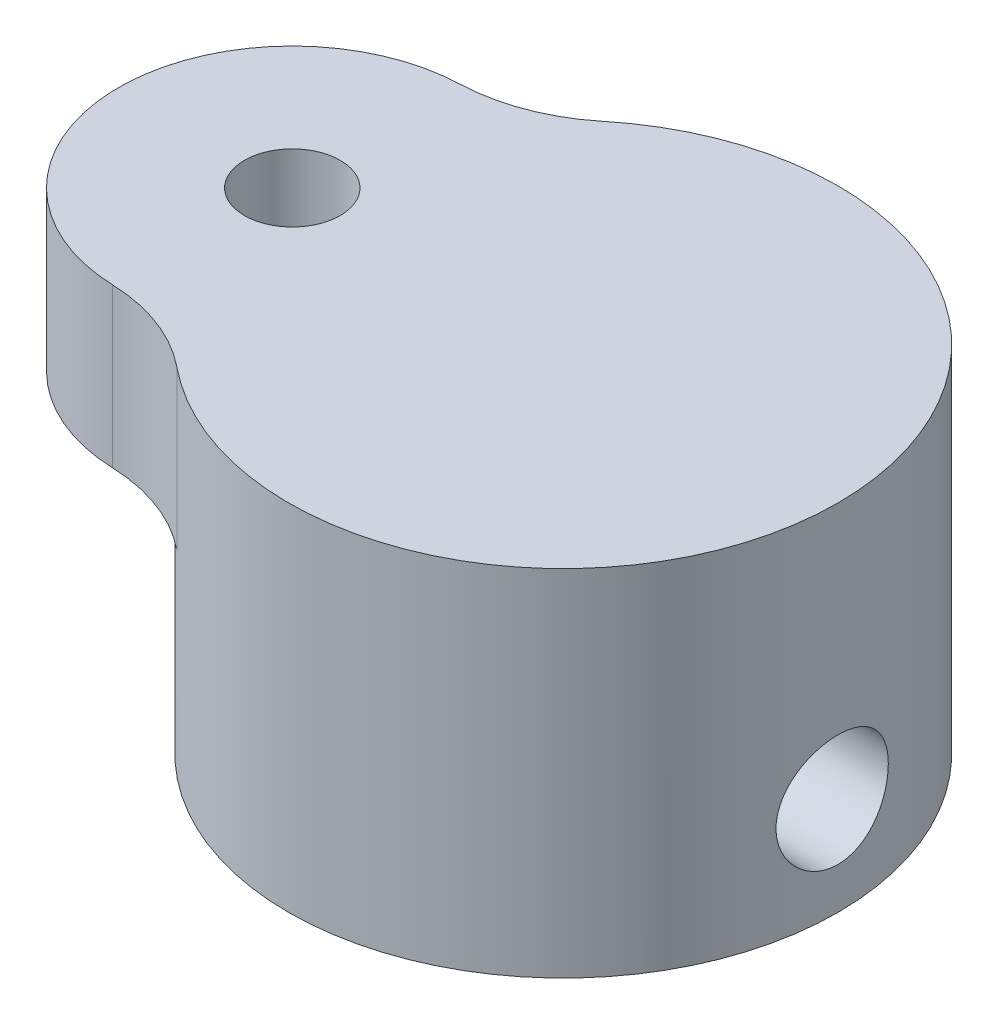
ISO-10303-21;
HEADER;
FILE_DESCRIPTION(('STEP AP214'),'2;1');
FILE_NAME('part.step','',(''),(''),'','','');
FILE_SCHEMA(('AUTOMOTIVE_DESIGN { 1 0 10303 214 1 1 1 1 }'));
ENDSEC;
DATA;
#1=APPLICATION_CONTEXT('core data for automotive mechanical design processes');
#2=APPLICATION_PROTOCOL_DEFINITION('international standard','automotive_design',2000,#1);
#3=PRODUCT_CONTEXT('',#1,'mechanical');
#4=PRODUCT('Part','Part','',(#3));
#5=PRODUCT_RELATED_PRODUCT_CATEGORY('part','',(#4));
#6=PRODUCT_DEFINITION_FORMATION('','',#4);
#7=PRODUCT_DEFINITION_CONTEXT('part definition',#1,'design');
#8=PRODUCT_DEFINITION('design','',#6,#7);
#9=PRODUCT_DEFINITION_SHAPE('','',#8);
#10=(LENGTH_UNIT() NAMED_UNIT(*) SI_UNIT(.MILLI.,.METRE.));
#11=(NAMED_UNIT(*) PLANE_ANGLE_UNIT() SI_UNIT($,.RADIAN.));
#12=(NAMED_UNIT(*) SI_UNIT($,.STERADIAN.) SOLID_ANGLE_UNIT());
#13=UNCERTAINTY_MEASURE_WITH_UNIT(LENGTH_MEASURE(1.E-05),#10,'distance_accuracy_value','');
#14=(GEOMETRIC_REPRESENTATION_CONTEXT(3) GLOBAL_UNCERTAINTY_ASSIGNED_CONTEXT((#13)) GLOBAL_UNIT_ASSIGNED_CONTEXT((#10,
#11,#12)) REPRESENTATION_CONTEXT('',''));
#15=CARTESIAN_POINT('',(0.,0.,0.));
#16=DIRECTION('',(0.,0.,1.));
#17=DIRECTION('',(1.,0.,0.));
#18=AXIS2_PLACEMENT_3D('',#15,#16,#17);
#19=CARTESIAN_POINT('',(0.,7.1628,0.));
#20=DIRECTION('',(0.,1.,0.));
#21=DIRECTION('',(0.,0.,1.));
#22=AXIS2_PLACEMENT_3D('',#19,#20,#21);
#23=PLANE('',#22);
#24=CARTESIAN_POINT('',(0.,7.1628,0.));
#25=DIRECTION('',(0.,1.,0.));
#26=DIRECTION('',(0.,0.,1.));
#27=AXIS2_PLACEMENT_3D('',#24,#25,#26);
#28=CIRCLE('',#27,10.033);
#29=CARTESIAN_POINT('',(-9.87921961814325,7.1628,-1.74988820685597));
#30=VERTEX_POINT('',#29);
#31=CARTESIAN_POINT('',(-9.87921961814325,7.1628,1.74988820685597));
#32=VERTEX_POINT('',#31);
#33=EDGE_CURVE('E61',#30,#32,#28,.T.);
#34=ORIENTED_EDGE('',*,*,#33,.T.);
#35=CARTESIAN_POINT('',(-9.899,7.1628,0.));
#36=DIRECTION('',(0.,1.,0.));
#37=DIRECTION('',(0.,0.,1.));
#38=AXIS2_PLACEMENT_3D('',#35,#36,#37);
#39=CIRCLE('',#38,1.75);
#40=EDGE_CURVE('E201',#32,#30,#39,.T.);
#41=ORIENTED_EDGE('',*,*,#40,.T.);
#42=EDGE_LOOP('',(#34,#41));
#43=FACE_BOUND('',#42,.T.);
#44=ADVANCED_FACE('F45',(#43),#23,.T.);
#45=CARTESIAN_POINT('',(0.,0.,0.));
#46=DIRECTION('',(0.,1.,0.));
#47=DIRECTION('',(0.,0.,1.));
#48=AXIS2_PLACEMENT_3D('',#45,#46,#47);
#49=PLANE('',#48);
#50=CARTESIAN_POINT('',(0.,0.,0.));
#51=DIRECTION('',(0.,1.,0.));
#52=DIRECTION('',(0.,0.,1.));
#53=AXIS2_PLACEMENT_3D('',#50,#51,#52);
#54=CIRCLE('',#53,10.033);
#55=CARTESIAN_POINT('',(0.,0.,10.033));
#56=VERTEX_POINT('',#55);
#57=EDGE_CURVE('E168',#56,#56,#54,.T.);
#58=ORIENTED_EDGE('',*,*,#57,.F.);
#59=EDGE_LOOP('',(#58));
#60=FACE_BOUND('',#59,.T.);
#61=CARTESIAN_POINT('',(0.,0.,0.));
#62=DIRECTION('',(0.,1.,0.));
#63=DIRECTION('',(0.,0.,1.));
#64=AXIS2_PLACEMENT_3D('',#61,#62,#63);
#65=CIRCLE('',#64,6.35);
#66=CARTESIAN_POINT('',(0.,0.,6.35));
#67=VERTEX_POINT('',#66);
#68=EDGE_CURVE('E171',#67,#67,#65,.T.);
#69=ORIENTED_EDGE('',*,*,#68,.T.);
#70=EDGE_LOOP('',(#69));
#71=FACE_BOUND('',#70,.T.);
#72=ADVANCED_FACE('F184',(#60,#71),#49,.F.);
#73=CARTESIAN_POINT('',(0.,7.1628,0.));
#74=DIRECTION('',(0.,-1.,0.));
#75=DIRECTION('',(0.,0.,-1.));
#76=AXIS2_PLACEMENT_3D('',#73,#74,#75);
#77=CYLINDRICAL_SURFACE('',#76,10.033);
#78=CARTESIAN_POINT('',(-10.033,1.51765,0.));
#79=CARTESIAN_POINT('',(-10.0329978938133,1.51765412690976,-0.113937335128595));
#80=CARTESIAN_POINT('',(-10.031039272284,1.5271760274107,-0.227926299373717));
#81=CARTESIAN_POINT('',(-10.0234149215753,1.56497967802849,-0.452678602559216));
#82=CARTESIAN_POINT('',(-10.0177463151306,1.59327598880525,-0.563439368184559));
#83=CARTESIAN_POINT('',(-10.003334558995,1.66771487473051,-0.778453560947287));
#84=CARTESIAN_POINT('',(-9.99459441647798,1.71383999905322,-0.882713235818526));
#85=CARTESIAN_POINT('',(-9.97498815621709,1.82257450550809,-1.0820075767369));
#86=CARTESIAN_POINT('',(-9.96412214851708,1.88518303444674,-1.1770427199044));
#87=CARTESIAN_POINT('',(-9.941287269236,2.02604385413697,-1.3565384414925));
#88=CARTESIAN_POINT('',(-9.92930618535681,2.10448401759188,-1.44085004585589));
#89=CARTESIAN_POINT('',(-9.90567969507248,2.27437773217348,-1.59521502792215));
#90=CARTESIAN_POINT('',(-9.89403431576375,2.36583233024397,-1.6652672574293));
#91=CARTESIAN_POINT('',(-9.87227826574829,2.56023730111255,-1.7897643723742));
#92=CARTESIAN_POINT('',(-9.86218329403356,2.66328900911285,-1.84405400740161));
#93=CARTESIAN_POINT('',(-9.84484492924291,2.877292345516,-1.93448997468271));
#94=CARTESIAN_POINT('',(-9.83760124107974,2.98824315501475,-1.97063818454932));
#95=CARTESIAN_POINT('',(-9.82690935694433,3.21328929618327,-2.02327955090995));
#96=CARTESIAN_POINT('',(-9.82341062960049,3.32732090792587,-2.0400346401901));
#97=CARTESIAN_POINT('',(-9.82045278872623,3.55662621379309,-2.05422793676965));
#98=CARTESIAN_POINT('',(-9.82099324320108,3.67189977377328,-2.05166820980854));
#99=CARTESIAN_POINT('',(-9.82600682712071,3.89849341853524,-2.02751608390376));
#100=CARTESIAN_POINT('',(-9.83041772181077,4.00984718845702,-2.00622486390185));
#101=CARTESIAN_POINT('',(-9.84257710508939,4.22736818084868,-1.94568993321072));
#102=CARTESIAN_POINT('',(-9.85032575949578,4.3335351453495,-1.90644533060257));
#103=CARTESIAN_POINT('',(-9.86835068432885,4.53853191496921,-1.81083260460387));
#104=CARTESIAN_POINT('',(-9.8786443579928,4.63730483076817,-1.75434592559944));
#105=CARTESIAN_POINT('',(-9.9005884273782,4.82408268751031,-1.62593607826633));
#106=CARTESIAN_POINT('',(-9.91223898563038,4.91208633589167,-1.55401105982649));
#107=CARTESIAN_POINT('',(-9.93585312560842,5.07656455703742,-1.39515784516706));
#108=CARTESIAN_POINT('',(-9.94781847235497,5.15279103656705,-1.30797280933532));
#109=CARTESIAN_POINT('',(-9.97051350902517,5.28957754530853,-1.12192576525978));
#110=CARTESIAN_POINT('',(-9.98124318170946,5.3501373559633,-1.0230635941427));
#111=CARTESIAN_POINT('',(-10.0002861376381,5.45392084940978,-0.816186808881739));
#112=CARTESIAN_POINT('',(-10.0085953293113,5.49711522404187,-0.708157091355755));
#113=CARTESIAN_POINT('',(-10.021830214061,5.56467209804774,-0.486166381256757));
#114=CARTESIAN_POINT('',(-10.0267563357125,5.58903698283302,-0.372206141944129));
#115=CARTESIAN_POINT('',(-10.0326100524303,5.61788981042246,-0.143720361692018));
#116=CARTESIAN_POINT('',(-10.0336059098286,5.62271712732434,-0.0292393722701828));
#117=CARTESIAN_POINT('',(-10.0316768825688,5.61327311187552,0.198893317994673));
#118=CARTESIAN_POINT('',(-10.0287522286538,5.59900290351559,0.312545067247062));
#119=CARTESIAN_POINT('',(-10.0193535952825,5.55205075939492,0.534691494930921));
#120=CARTESIAN_POINT('',(-10.0129133709725,5.51954384441336,0.64322471890889));
#121=CARTESIAN_POINT('',(-9.99720334369773,5.43723298189374,0.85329961069118));
#122=CARTESIAN_POINT('',(-9.98793332177014,5.38742769580876,0.954840736718576));
#123=CARTESIAN_POINT('',(-9.9674222882272,5.27120592029177,1.14947394805684));
#124=CARTESIAN_POINT('',(-9.95615771065381,5.20458624036418,1.24244216515935));
#125=CARTESIAN_POINT('',(-9.9329607368187,5.05689778883718,1.416001625691));
#126=CARTESIAN_POINT('',(-9.92102826561899,4.97582739362231,1.49659147644804));
#127=CARTESIAN_POINT('',(-9.89760895471395,4.79999089784795,1.6444237357585));
#128=CARTESIAN_POINT('',(-9.88613226216581,4.7050269257672,1.71143267937341));
#129=CARTESIAN_POINT('',(-9.86514317664098,4.5049921563381,1.82854960174829));
#130=CARTESIAN_POINT('',(-9.85563070332024,4.39992177263831,1.87865827184698));
#131=CARTESIAN_POINT('',(-9.83972993039722,4.18319583046762,1.9602381099439));
#132=CARTESIAN_POINT('',(-9.83332510073798,4.07157873463212,1.99180808137788));
#133=CARTESIAN_POINT('',(-9.82433088275876,3.84447853012828,2.03571190927881));
#134=CARTESIAN_POINT('',(-9.82174097160052,3.72899595344692,2.04804840172613));
#135=CARTESIAN_POINT('',(-9.82069976705395,3.49978911420012,2.05303412857708));
#136=CARTESIAN_POINT('',(-9.82217086359981,3.38607307518363,2.0460525454146));
#137=CARTESIAN_POINT('',(-9.82891202993507,3.16147332829043,2.01341751170842));
#138=CARTESIAN_POINT('',(-9.83418206612248,3.05058959537066,1.98776422631774));
#139=CARTESIAN_POINT('',(-9.84789188170742,2.83505032094469,1.91868187978882));
#140=CARTESIAN_POINT('',(-9.85632323691163,2.73037907570157,1.87530003383152));
#141=CARTESIAN_POINT('',(-9.87541013015298,2.52974362280196,1.77203520491748));
#142=CARTESIAN_POINT('',(-9.88606586525967,2.43378018769786,1.7121507597577));
#143=CARTESIAN_POINT('',(-9.90863706766511,2.25145024268038,1.57632803683832));
#144=CARTESIAN_POINT('',(-9.9205715213222,2.16528406690173,1.5001239341877));
#145=CARTESIAN_POINT('',(-9.94422122609122,2.0068403447861,1.33437162866727));
#146=CARTESIAN_POINT('',(-9.95593642615861,1.93456599718246,1.24482036088589));
#147=CARTESIAN_POINT('',(-9.9779801403421,1.80520264797843,1.05372857754947));
#148=CARTESIAN_POINT('',(-9.98829194532228,1.74828981853062,0.952066784219952));
#149=CARTESIAN_POINT('',(-10.0062019110632,1.65244683893929,0.740437723513406));
#150=CARTESIAN_POINT('',(-10.013802477838,1.61350073566951,0.630477925507787));
#151=CARTESIAN_POINT('',(-10.0239843601777,1.56210286826681,0.433584301903527));
#152=CARTESIAN_POINT('',(-10.0273451786663,1.54546323143088,0.347759291653972));
#153=CARTESIAN_POINT('',(-10.0318537675998,1.52323540625218,0.174632931031843));
#154=CARTESIAN_POINT('',(-10.0330016143674,1.51764683677205,0.0873316316793533));
#155=CARTESIAN_POINT('',(-10.033,1.51765,0.));
#156=B_SPLINE_CURVE_WITH_KNOTS('',3,(#78,#79,#80,#81,#82,#83,#84,#85,#86,#87,#88,#89,#90,#91,
#92,#93,#94,#95,#96,#97,#98,#99,#100,#101,#102,#103,#104,#105,#106,#107,#108,#109,#110,#111,
#112,#113,#114,#115,#116,#117,#118,#119,#120,#121,#122,#123,#124,#125,#126,#127,#128,#129,#130,
#131,#132,#133,#134,#135,#136,#137,#138,#139,#140,#141,#142,#143,#144,#145,#146,#147,#148,#149,
#150,#151,#152,#153,#154,#155),.UNSPECIFIED.,.T.,.F.,(4,2,2,2,2,2,2,2,2,2,2,2,2,2,2,2,2,2,2,2,2,
2,2,2,2,2,2,2,2,2,2,2,2,2,2,2,2,2,4),(0.,0.341492478892308,0.683250115361904,1.02467408340952,
1.3660803825674,1.71180542016708,2.05755828529237,2.4066092406017,2.75562406215634,
3.09986779159228,3.4440747043284,3.78284632249342,4.12163477256391,4.46280729262001,
4.80402072121088,5.15165454060758,5.49929320939113,5.84751615969911,6.19569498819278,
6.53779918259876,6.87988324324192,7.21873908505787,7.55762115336245,7.90081279459216,
8.24404301957854,8.59274929700338,8.94144130818562,9.28825766384375,9.63502648356236,
9.97521430987589,10.3153991272313,10.6546837990068,10.9939985425711,11.339329708926,
11.6847402962524,12.0339583913883,12.3828658069735,12.6446248165953,12.906374798322),.UNSPECIFIED.);
#157=CARTESIAN_POINT('',(-10.033,1.51765,0.));
#158=VERTEX_POINT('',#157);
#159=EDGE_CURVE('E144',#158,#158,#156,.T.);
#160=ORIENTED_EDGE('',*,*,#159,.T.);
#161=EDGE_LOOP('',(#160));
#162=FACE_BOUND('',#161,.T.);
#163=CARTESIAN_POINT('',(9.82111413728096,3.5687,-2.05105));
#164=CARTESIAN_POINT('',(9.82111641700994,3.45479070854592,-2.05104585186305));
#165=CARTESIAN_POINT('',(9.82311744242779,3.34082973218682,-2.04152847929373));
#166=CARTESIAN_POINT('',(9.83089291078977,3.11613553772995,-2.00374444274635));
#167=CARTESIAN_POINT('',(9.83667030613687,3.00540491597132,-1.97546310865913));
#168=CARTESIAN_POINT('',(9.8513174665969,2.7904545717481,-1.90106800580175));
#169=CARTESIAN_POINT('',(9.86018408268367,2.68622834605236,-1.85497239097963));
#170=CARTESIAN_POINT('',(9.88000688642241,2.48699042418785,-1.74630745184386));
#171=CARTESIAN_POINT('',(9.89096297443006,2.39197828893635,-1.68373891304938));
#172=CARTESIAN_POINT('',(9.91391102941313,2.21245814367478,-1.54291914235383));
#173=CARTESIAN_POINT('',(9.92591480070018,2.12810603570093,-1.46447105443185));
#174=CARTESIAN_POINT('',(9.94950193364776,1.97366243684184,-1.29454428435784));
#175=CARTESIAN_POINT('',(9.96108526507629,1.90357196978659,-1.20306466748531));
#176=CARTESIAN_POINT('',(9.98265399374422,1.77903359759631,-1.00863623699989));
#177=CARTESIAN_POINT('',(9.9926238460838,1.72473426001659,-0.905590388098401));
#178=CARTESIAN_POINT('',(10.0097095122359,1.63427875847248,-0.69159971600163));
#179=CARTESIAN_POINT('',(10.0168256052719,1.59812081939293,-0.580655666849776));
#180=CARTESIAN_POINT('',(10.0273185621132,1.5454609820255,-0.355636577811897));
#181=CARTESIAN_POINT('',(10.0307454890407,1.52869568032405,-0.241625554126666));
#182=CARTESIAN_POINT('',(10.0336470214781,1.51447481640836,-0.0123610303800057));
#183=CARTESIAN_POINT('',(10.0331220241742,1.51701731367378,0.102892343657019));
#184=CARTESIAN_POINT('',(10.0282175321614,1.54114091816654,0.329558628874316));
#185=CARTESIAN_POINT('',(10.0238954907579,1.56243825613225,0.441003165488482));
#186=CARTESIAN_POINT('',(10.0119474788761,1.62301641127114,0.658702476181237));
#187=CARTESIAN_POINT('',(10.0043213720761,1.66229797045542,0.764957035926339));
#188=CARTESIAN_POINT('',(9.98652793446338,1.75798965935356,0.970064750306471));
#189=CARTESIAN_POINT('',(9.97634430969669,1.81451013338774,1.0688649531675));
#190=CARTESIAN_POINT('',(9.9545571090764,1.94299345262896,1.25568331295456));
#191=CARTESIAN_POINT('',(9.94295336296225,2.01495815024898,1.34370017451267));
#192=CARTESIAN_POINT('',(9.9193570784542,2.17384116889063,1.50813829046999));
#193=CARTESIAN_POINT('',(9.90736130777368,2.26100784788981,1.58431930257503));
#194=CARTESIAN_POINT('',(9.88453276408179,2.44700141490941,1.72102259441587));
#195=CARTESIAN_POINT('',(9.87370001508574,2.5458285436188,1.78154455084317));
#196=CARTESIAN_POINT('',(9.85441715624857,2.75269258122298,1.88529999905834));
#197=CARTESIAN_POINT('',(9.84597262394955,2.86075029435133,1.92849311714358));
#198=CARTESIAN_POINT('',(9.8325030084139,3.08280231367069,1.99603906081431));
#199=CARTESIAN_POINT('',(9.827477457694,3.19679580595685,2.02039446217568));
#200=CARTESIAN_POINT('',(9.82150886765315,3.42530203860646,2.04921146082685));
#201=CARTESIAN_POINT('',(9.82049450673462,3.53976913066968,2.05402064615864));
#202=CARTESIAN_POINT('',(9.82247148441678,3.76786980735771,2.04454533649268));
#203=CARTESIAN_POINT('',(9.82546258501115,3.88150344110359,2.03026197598263));
#204=CARTESIAN_POINT('',(9.83504654513573,4.10353367335875,1.98330713373273));
#205=CARTESIAN_POINT('',(9.84160275136137,4.21197155038702,1.95082267819405));
#206=CARTESIAN_POINT('',(9.85754585201383,4.42186558294604,1.86858831258253));
#207=CARTESIAN_POINT('',(9.86693298845883,4.52332114064232,1.81883692629299));
#208=CARTESIAN_POINT('',(9.88763967718535,4.71788770861023,1.70269897150141));
#209=CARTESIAN_POINT('',(9.89898373959267,4.81086669607487,1.63609568075514));
#210=CARTESIAN_POINT('',(9.92225944798446,4.98445540767873,1.48843220373278));
#211=CARTESIAN_POINT('',(9.93419115718653,5.06506379716335,1.40737045958204));
#212=CARTESIAN_POINT('',(9.95753006641841,5.21294815319668,1.23152784738485));
#213=CARTESIAN_POINT('',(9.96892573338521,5.27998864953858,1.13654716667885));
#214=CARTESIAN_POINT('',(9.98970544029949,5.39716088007622,0.936469398082321));
#215=CARTESIAN_POINT('',(9.99908956709438,5.44729334432291,0.831372747228653));
#216=CARTESIAN_POINT('',(10.0147397480648,5.52888669837754,0.614653769029584));
#217=CARTESIAN_POINT('',(10.0210239608868,5.5604565385068,0.503073830698375));
#218=CARTESIAN_POINT('',(10.0298442856952,5.60437264756509,0.276052963940276));
#219=CARTESIAN_POINT('',(10.0323808703404,5.61672134071683,0.160612524286489));
#220=CARTESIAN_POINT('',(10.0334083030885,5.62174725724706,-0.0686064958711506));
#221=CARTESIAN_POINT('',(10.0319718433088,5.61477792444398,-0.182377147942628));
#222=CARTESIAN_POINT('',(10.025368089562,5.58214835239118,-0.407089405559039));
#223=CARTESIAN_POINT('',(10.0202008468877,5.55648837011043,-0.51803104997697));
#224=CARTESIAN_POINT('',(10.0067189451876,5.48736588123684,-0.733703610260928));
#225=CARTESIAN_POINT('',(9.9984121109666,5.44394761170417,-0.83844922397554));
#226=CARTESIAN_POINT('',(9.97954373424844,5.34058662739903,-1.03921854548043));
#227=CARTESIAN_POINT('',(9.9689820039445,5.28064253609562,-1.13524152582609));
#228=CARTESIAN_POINT('',(9.94653994916177,5.1447483296006,-1.31758216561275));
#229=CARTESIAN_POINT('',(9.93464045928874,5.06854631959138,-1.40370975524391));
#230=CARTESIAN_POINT('',(9.9109753613191,4.90281481315127,-1.56207660063106));
#231=CARTESIAN_POINT('',(9.8992097857093,4.81328215396225,-1.63431255118588));
#232=CARTESIAN_POINT('',(9.87699718419668,4.62221084385084,-1.76362722423683));
#233=CARTESIAN_POINT('',(9.86656664024144,4.52054745410417,-1.82052459876578));
#234=CARTESIAN_POINT('',(9.8484076666546,4.30891649350264,-1.91633826220755));
#235=CARTESIAN_POINT('',(9.84067682455012,4.19895644402761,-1.95527061484436));
#236=CARTESIAN_POINT('',(9.83030993792063,4.00209793659127,-2.00663559357303));
#237=CARTESIAN_POINT('',(9.82688322562552,3.91631037902177,-2.02326071467501));
#238=CARTESIAN_POINT('',(9.82228449398423,3.74325862876358,-2.04546930061907));
#239=CARTESIAN_POINT('',(9.82111239020854,3.6559944914926,-2.05105317892861));
#240=CARTESIAN_POINT('',(9.82111413728096,3.5687,-2.05105));
#241=B_SPLINE_CURVE_WITH_KNOTS('',3,(#163,#164,#165,#166,#167,#168,#169,#170,#171,#172,#173,
#174,#175,#176,#177,#178,#179,#180,#181,#182,#183,#184,#185,#186,#187,#188,#189,#190,#191,#192,
#193,#194,#195,#196,#197,#198,#199,#200,#201,#202,#203,#204,#205,#206,#207,#208,#209,#210,#211,
#212,#213,#214,#215,#216,#217,#218,#219,#220,#221,#222,#223,#224,#225,#226,#227,#228,#229,#230,
#231,#232,#233,#234,#235,#236,#237,#238,#239,#240),.UNSPECIFIED.,.T.,.F.,(4,2,2,2,2,2,2,2,2,2,2,
2,2,2,2,2,2,2,2,2,2,2,2,2,2,2,2,2,2,2,2,2,2,2,2,2,2,2,4),(0.,0.341408181380367,
0.683083598786018,1.0244117402606,1.36572360828837,1.71155895437145,2.05741911890077,
2.40643511540646,2.75541695443132,3.09960087357233,3.44375020114455,3.78278017475171,
4.12182413765914,4.4630855216318,4.80438786011886,5.1519029974757,5.49942530931567,
5.84775266060766,6.19603237492264,6.53809083266442,6.88012896604152,7.21871527725275,
7.55733054265119,7.90054401373752,8.24379448787712,8.59256965027019,8.9413297514045,
9.28802188286616,9.63467028504007,9.97501846058137,10.3153619569234,10.6548627494904,
10.9943918295837,11.3396228686036,11.6849359461875,12.0341684878209,12.3830881493377,
12.6447364250731,12.9063749025368),.UNSPECIFIED.);
#242=CARTESIAN_POINT('',(9.82111413728096,3.5687,-2.05105));
#243=VERTEX_POINT('',#242);
#244=EDGE_CURVE('E137',#243,#243,#241,.T.);
#245=ORIENTED_EDGE('',*,*,#244,.T.);
#246=EDGE_LOOP('',(#245));
#247=FACE_BOUND('',#246,.T.);
#248=CARTESIAN_POINT('',(-6.344360330031,7.1628,-7.77239866468061));
#249=VERTEX_POINT('',#248);
#250=EDGE_CURVE('E11',#249,#30,#28,.T.);
#251=ORIENTED_EDGE('',*,*,#250,.F.);
#252=DIRECTION('',(0.,-1.,0.));
#253=VECTOR('',#252,1.);
#254=CARTESIAN_POINT('',(-6.344360330031,12.954,-7.77239866468061));
#255=LINE('',#254,#253);
#256=CARTESIAN_POINT('',(-6.344360330031,12.954,-7.77239866468061));
#257=VERTEX_POINT('',#256);
#258=EDGE_CURVE('E216',#257,#249,#255,.T.);
#259=ORIENTED_EDGE('',*,*,#258,.F.);
#260=CARTESIAN_POINT('',(0.,12.954,0.));
#261=DIRECTION('',(0.,1.,0.));
#262=DIRECTION('',(0.,0.,1.));
#263=AXIS2_PLACEMENT_3D('',#260,#261,#262);
#264=CIRCLE('',#263,10.033);
#265=CARTESIAN_POINT('',(-6.34436033003099,12.954,7.77239866468062));
#266=VERTEX_POINT('',#265);
#267=EDGE_CURVE('E116',#266,#257,#264,.T.);
#268=ORIENTED_EDGE('',*,*,#267,.F.);
#269=DIRECTION('',(0.,-1.,0.));
#270=VECTOR('',#269,1.);
#271=CARTESIAN_POINT('',(-6.34436033003099,12.954,7.77239866468062));
#272=LINE('',#271,#270);
#273=CARTESIAN_POINT('',(-6.34436033003099,7.1628,7.77239866468062));
#274=VERTEX_POINT('',#273);
#275=EDGE_CURVE('E133',#266,#274,#272,.T.);
#276=ORIENTED_EDGE('',*,*,#275,.T.);
#277=EDGE_CURVE('E63',#32,#274,#28,.T.);
#278=ORIENTED_EDGE('',*,*,#277,.F.);
#279=ORIENTED_EDGE('',*,*,#33,.F.);
#280=EDGE_LOOP('',(#251,#259,#268,#276,#278,#279));
#281=FACE_BOUND('',#280,.T.);
#282=ORIENTED_EDGE('',*,*,#57,.T.);
#283=EDGE_LOOP('',(#282));
#284=FACE_BOUND('',#283,.T.);
#285=ADVANCED_FACE('F47',(#162,#247,#281,#284),#77,.T.);
#286=CARTESIAN_POINT('',(0.,7.1628,0.));
#287=DIRECTION('',(0.,-1.,0.));
#288=DIRECTION('',(0.,0.,-1.));
#289=AXIS2_PLACEMENT_3D('',#286,#287,#288);
#290=CYLINDRICAL_SURFACE('',#289,6.35);
#291=CARTESIAN_POINT('',(-6.00963342455262,3.5687,-2.05105));
#292=CARTESIAN_POINT('',(-6.00963362851552,3.68063375872759,-2.05104985367258));
#293=CARTESIAN_POINT('',(-6.01279489544972,3.79256983941369,-2.04185596109641));
#294=CARTESIAN_POINT('',(-6.02503768357329,4.01313968245331,-2.00543780084071));
#295=CARTESIAN_POINT('',(-6.03412048807175,4.12177272363322,-1.97820962477074));
#296=CARTESIAN_POINT('',(-6.05707258261845,4.33250777765414,-1.90676787590774));
#297=CARTESIAN_POINT('',(-6.07093294905419,4.43462154881362,-1.8625859523163));
#298=CARTESIAN_POINT('',(-6.10186576918524,4.63001819996293,-1.75859774413233));
#299=CARTESIAN_POINT('',(-6.11893886198693,4.72329931731686,-1.69878834985187));
#300=CARTESIAN_POINT('',(-6.15507649281742,4.90180771253177,-1.5628909095963));
#301=CARTESIAN_POINT('',(-6.17418842511648,4.98666316985074,-1.48632694353293));
#302=CARTESIAN_POINT('',(-6.21184836398477,5.14258103637644,-1.32011077292792));
#303=CARTESIAN_POINT('',(-6.23039628573364,5.21364137953233,-1.23045661142634));
#304=CARTESIAN_POINT('',(-6.26538376704715,5.34161557995134,-1.03790968401057));
#305=CARTESIAN_POINT('',(-6.28176105416077,5.39814320913343,-0.93474790362382));
#306=CARTESIAN_POINT('',(-6.31000607288983,5.49289819393366,-0.719761277942438));
#307=CARTESIAN_POINT('',(-6.32187494107721,5.53113016251822,-0.607938624622403));
#308=CARTESIAN_POINT('',(-6.33943024076526,5.58695745858026,-0.382700298545073));
#309=CARTESIAN_POINT('',(-6.34530682927204,5.60518901307135,-0.269457414963459));
#310=CARTESIAN_POINT('',(-6.3508887260063,5.62251733062421,-0.0413776347337906));
#311=CARTESIAN_POINT('',(-6.35059553012879,5.62161873188649,0.0734588687855287));
#312=CARTESIAN_POINT('',(-6.34400154129511,5.60112335074218,0.296975642949369));
#313=CARTESIAN_POINT('',(-6.33792256178752,5.5822169266772,0.405726818168495));
#314=CARTESIAN_POINT('',(-6.32071567339179,5.52737974234227,0.61842064829633));
#315=CARTESIAN_POINT('',(-6.30958742825774,5.49144784828756,0.722362982461662));
#316=CARTESIAN_POINT('',(-6.28324225544386,5.40315642693073,0.924039902303551));
#317=CARTESIAN_POINT('',(-6.2679751612164,5.35059392083843,1.0216788029816));
#318=CARTESIAN_POINT('',(-6.23495126919223,5.2306983146752,1.20695994835305));
#319=CARTESIAN_POINT('',(-6.21719381023699,5.16336128947838,1.29459952711807));
#320=CARTESIAN_POINT('',(-6.18014037920693,5.01231596628338,1.4615063121667));
#321=CARTESIAN_POINT('',(-6.16081110237299,4.92801383731119,1.54022949462462));
#322=CARTESIAN_POINT('',(-6.12346475446555,4.74723125906484,1.68259018342025));
#323=CARTESIAN_POINT('',(-6.10544786099172,4.65074916633472,1.74622565061463));
#324=CARTESIAN_POINT('',(-6.0725909809852,4.44671602022846,1.85729635692383));
#325=CARTESIAN_POINT('',(-6.05779410995583,4.33904027808388,1.9045162617717));
#326=CARTESIAN_POINT('',(-6.03355475978606,4.11666997518731,1.97997630423321));
#327=CARTESIAN_POINT('',(-6.02411019965747,4.00197816153965,2.00822381913859));
#328=CARTESIAN_POINT('',(-6.01211120322903,3.77407252550853,2.04385895457965));
#329=CARTESIAN_POINT('',(-6.00928008566783,3.66100429016655,2.05208485870149));
#330=CARTESIAN_POINT('',(-6.01005773708472,3.4350906291979,2.04980718057357));
#331=CARTESIAN_POINT('',(-6.0136654261116,3.3222451693841,2.0393067392073));
#332=CARTESIAN_POINT('',(-6.02663968885451,3.10368978629064,2.00062569410623));
#333=CARTESIAN_POINT('',(-6.0358208690994,2.99786706324965,1.973013687341));
#334=CARTESIAN_POINT('',(-6.0587074559829,2.79237303298712,1.90156817467679));
#335=CARTESIAN_POINT('',(-6.0724136330195,2.69270277667877,1.85773190638135));
#336=CARTESIAN_POINT('',(-6.10331938495686,2.49900767632801,1.75357359237088));
#337=CARTESIAN_POINT('',(-6.12061200430327,2.4052444214051,1.69279342603796));
#338=CARTESIAN_POINT('',(-6.15655562941614,2.22894373694502,1.55699962727711));
#339=CARTESIAN_POINT('',(-6.17520701096997,2.14640943118923,1.48198204798703));
#340=CARTESIAN_POINT('',(-6.21277588315668,1.99109785712795,1.3158550556026));
#341=CARTESIAN_POINT('',(-6.23166796552144,1.91892208199029,1.22417598706551));
#342=CARTESIAN_POINT('',(-6.26676136836702,1.79094816289126,1.02954630907651));
#343=CARTESIAN_POINT('',(-6.28296279988114,1.73514934304,0.926596165031635));
#344=CARTESIAN_POINT('',(-6.31076446734188,1.64203910972754,0.712926412176655));
#345=CARTESIAN_POINT('',(-6.32239646911686,1.60459959641907,0.602266974827646));
#346=CARTESIAN_POINT('',(-6.3398873343773,1.54900127196817,0.375776427112219));
#347=CARTESIAN_POINT('',(-6.34574814111974,1.53083597071947,0.259947071284775));
#348=CARTESIAN_POINT('',(-6.35089855665113,1.51485750432287,0.03192363266999));
#349=CARTESIAN_POINT('',(-6.35046780969632,1.51617825881389,-0.0802041328043846));
#350=CARTESIAN_POINT('',(-6.34376263388769,1.5370191305691,-0.302566615451122));
#351=CARTESIAN_POINT('',(-6.33748863127153,1.55653792037346,-0.412801470104983));
#352=CARTESIAN_POINT('',(-6.31989753060521,1.61265729322323,-0.626706826916137));
#353=CARTESIAN_POINT('',(-6.30865299373859,1.64901244594064,-0.730448106983349));
#354=CARTESIAN_POINT('',(-6.28227908216166,1.73754832179825,-0.930403923087996));
#355=CARTESIAN_POINT('',(-6.26714902121325,1.78973184074529,-1.02661712564106));
#356=CARTESIAN_POINT('',(-6.23390496869175,1.91057943488905,-1.21250334387878));
#357=CARTESIAN_POINT('',(-6.21570415939681,1.97976251018325,-1.30182323930495));
#358=CARTESIAN_POINT('',(-6.17860069890561,2.13174632762002,-1.46787116408725));
#359=CARTESIAN_POINT('',(-6.15969783218659,2.21455127871042,-1.54459528685984));
#360=CARTESIAN_POINT('',(-6.12251513265752,2.39500605958895,-1.68607834790773));
#361=CARTESIAN_POINT('',(-6.1042824058615,2.49308378841316,-1.75030553075849));
#362=CARTESIAN_POINT('',(-6.07135940684904,2.6991997720777,-1.86130719122568));
#363=CARTESIAN_POINT('',(-6.0566679483133,2.80723467446817,-1.90808751639399));
#364=CARTESIAN_POINT('',(-6.03347326354441,3.02295748144525,-1.98016287346651));
#365=CARTESIAN_POINT('',(-6.02462814127754,3.13020592165209,-2.00666304074723));
#366=CARTESIAN_POINT('',(-6.01270896454131,3.34786944483045,-2.04210411013382));
#367=CARTESIAN_POINT('',(-6.00963322335459,3.45828359269863,-2.05105014434383));
#368=CARTESIAN_POINT('',(-6.00963342455262,3.5687,-2.05105));
#369=B_SPLINE_CURVE_WITH_KNOTS('',3,(#291,#292,#293,#294,#295,#296,#297,#298,#299,#300,#301,
#302,#303,#304,#305,#306,#307,#308,#309,#310,#311,#312,#313,#314,#315,#316,#317,#318,#319,#320,
#321,#322,#323,#324,#325,#326,#327,#328,#329,#330,#331,#332,#333,#334,#335,#336,#337,#338,#339,
#340,#341,#342,#343,#344,#345,#346,#347,#348,#349,#350,#351,#352,#353,#354,#355,#356,#357,#358,
#359,#360,#361,#362,#363,#364,#365,#366,#367,#368),.UNSPECIFIED.,.T.,.F.,(4,2,2,2,2,2,2,2,2,2,2,
2,2,2,2,2,2,2,2,2,2,2,2,2,2,2,2,2,2,2,2,2,2,2,2,2,2,2,4),(0.,0.335392901042299,0.67085851223762,
1.0057009002177,1.34060996881391,1.68667595029639,2.032793721075,2.38733214374477,
2.74178112790235,3.08459486513093,3.42732548641553,3.75742447432433,4.08754544775325,
4.4218620067547,4.75626749094474,5.10551066846574,5.4548010202237,5.80851417551521,
6.1620897119721,6.50058540594172,6.83902433093056,7.16677931430049,7.49459012800988,
7.83230629056732,8.17011621111752,8.52303495986125,8.87593914132062,9.22634464144856,
9.57663211385423,9.91139942247123,10.246142313321,10.5761521068866,10.906220224946,
11.247998130756,11.589881839664,11.9441041249686,12.2982075809306,12.6291507320904,
12.9599971147049),.UNSPECIFIED.);
#370=CARTESIAN_POINT('',(-6.00963342455262,3.5687,-2.05105));
#371=VERTEX_POINT('',#370);
#372=EDGE_CURVE('E50',#371,#371,#369,.T.);
#373=ORIENTED_EDGE('',*,*,#372,.F.);
#374=EDGE_LOOP('',(#373));
#375=FACE_BOUND('',#374,.T.);
#376=CARTESIAN_POINT('',(6.00963342455262,3.5687,-2.05105));
#377=CARTESIAN_POINT('',(6.00963362851552,3.45676624127241,-2.05104985367258));
#378=CARTESIAN_POINT('',(6.01279489544972,3.34483016058631,-2.04185596109641));
#379=CARTESIAN_POINT('',(6.02503768357329,3.12426031754669,-2.00543780084071));
#380=CARTESIAN_POINT('',(6.03412048807175,3.01562727636678,-1.97820962477074));
#381=CARTESIAN_POINT('',(6.05707258261845,2.80489222234586,-1.90676787590774));
#382=CARTESIAN_POINT('',(6.07093294905419,2.70277845118638,-1.8625859523163));
#383=CARTESIAN_POINT('',(6.10186576918524,2.50738180003707,-1.75859774413233));
#384=CARTESIAN_POINT('',(6.11893886198693,2.41410068268314,-1.69878834985187));
#385=CARTESIAN_POINT('',(6.15507649281742,2.23559228746823,-1.5628909095963));
#386=CARTESIAN_POINT('',(6.17418842511648,2.15073683014926,-1.48632694353293));
#387=CARTESIAN_POINT('',(6.21184836398477,1.99481896362356,-1.32011077292792));
#388=CARTESIAN_POINT('',(6.23039628573365,1.92375862046767,-1.23045661142634));
#389=CARTESIAN_POINT('',(6.26538376704715,1.79578442004866,-1.03790968401057));
#390=CARTESIAN_POINT('',(6.28176105416077,1.73925679086657,-0.934747903623821));
#391=CARTESIAN_POINT('',(6.31000607288983,1.64450180606634,-0.719761277942439));
#392=CARTESIAN_POINT('',(6.32187494107721,1.60626983748179,-0.607938624622404));
#393=CARTESIAN_POINT('',(6.33943024076526,1.55044254141974,-0.382700298545074));
#394=CARTESIAN_POINT('',(6.34530682927204,1.53221098692865,-0.26945741496346));
#395=CARTESIAN_POINT('',(6.3508887260063,1.51488266937579,-0.0413776347337919));
#396=CARTESIAN_POINT('',(6.35059553012879,1.51578126811351,0.0734588687855273));
#397=CARTESIAN_POINT('',(6.34400154129511,1.53627664925782,0.296975642949367));
#398=CARTESIAN_POINT('',(6.33792256178752,1.5551830733228,0.405726818168494));
#399=CARTESIAN_POINT('',(6.32071567339179,1.61002025765773,0.618420648296329));
#400=CARTESIAN_POINT('',(6.30958742825774,1.64595215171244,0.722362982461661));
#401=CARTESIAN_POINT('',(6.28324225544386,1.73424357306927,0.92403990230355));
#402=CARTESIAN_POINT('',(6.2679751612164,1.78680607916157,1.0216788029816));
#403=CARTESIAN_POINT('',(6.23495126919223,1.9067016853248,1.20695994835305));
#404=CARTESIAN_POINT('',(6.21719381023699,1.97403871052161,1.29459952711807));
#405=CARTESIAN_POINT('',(6.18014037920693,2.12508403371662,1.4615063121667));
#406=CARTESIAN_POINT('',(6.16081110237299,2.20938616268881,1.54022949462462));
#407=CARTESIAN_POINT('',(6.12346475446555,2.39016874093516,1.68259018342025));
#408=CARTESIAN_POINT('',(6.10544786099172,2.48665083366528,1.74622565061463));
#409=CARTESIAN_POINT('',(6.0725909809852,2.69068397977154,1.85729635692383));
#410=CARTESIAN_POINT('',(6.05779410995583,2.79835972191612,1.9045162617717));
#411=CARTESIAN_POINT('',(6.03355475978606,3.02073002481269,1.97997630423321));
#412=CARTESIAN_POINT('',(6.02411019965747,3.13542183846035,2.00822381913859));
#413=CARTESIAN_POINT('',(6.01211120322903,3.36332747449147,2.04385895457965));
#414=CARTESIAN_POINT('',(6.00928008566783,3.47639570983345,2.05208485870149));
#415=CARTESIAN_POINT('',(6.01005773708472,3.7023093708021,2.04980718057357));
#416=CARTESIAN_POINT('',(6.0136654261116,3.8151548306159,2.0393067392073));
#417=CARTESIAN_POINT('',(6.02663968885451,4.03371021370936,2.00062569410623));
#418=CARTESIAN_POINT('',(6.0358208690994,4.13953293675035,1.973013687341));
#419=CARTESIAN_POINT('',(6.0587074559829,4.34502696701288,1.90156817467679));
#420=CARTESIAN_POINT('',(6.0724136330195,4.44469722332123,1.85773190638135));
#421=CARTESIAN_POINT('',(6.10331938495686,4.63839232367199,1.75357359237088));
#422=CARTESIAN_POINT('',(6.12061200430327,4.7321555785949,1.69279342603796));
#423=CARTESIAN_POINT('',(6.15655562941614,4.90845626305498,1.55699962727711));
#424=CARTESIAN_POINT('',(6.17520701096997,4.99099056881077,1.48198204798703));
#425=CARTESIAN_POINT('',(6.21277588315668,5.14630214287205,1.3158550556026));
#426=CARTESIAN_POINT('',(6.23166796552144,5.21847791800971,1.22417598706551));
#427=CARTESIAN_POINT('',(6.26676136836702,5.34645183710874,1.02954630907651));
#428=CARTESIAN_POINT('',(6.28296279988114,5.40225065696,0.926596165031638));
#429=CARTESIAN_POINT('',(6.31076446734188,5.49536089027246,0.712926412176657));
#430=CARTESIAN_POINT('',(6.32239646911686,5.53280040358093,0.602266974827648));
#431=CARTESIAN_POINT('',(6.3398873343773,5.58839872803183,0.375776427112221));
#432=CARTESIAN_POINT('',(6.34574814111974,5.60656402928053,0.259947071284777));
#433=CARTESIAN_POINT('',(6.35089855665113,5.62254249567713,0.0319236326699922));
#434=CARTESIAN_POINT('',(6.35046780969632,5.62122174118611,-0.0802041328043825));
#435=CARTESIAN_POINT('',(6.34376263388769,5.6003808694309,-0.30256661545112));
#436=CARTESIAN_POINT('',(6.33748863127153,5.58086207962654,-0.412801470104981));
#437=CARTESIAN_POINT('',(6.31989753060521,5.52474270677677,-0.626706826916135));
#438=CARTESIAN_POINT('',(6.30865299373859,5.48838755405936,-0.730448106983347));
#439=CARTESIAN_POINT('',(6.28227908216166,5.39985167820175,-0.930403923087994));
#440=CARTESIAN_POINT('',(6.26714902121325,5.34766815925471,-1.02661712564106));
#441=CARTESIAN_POINT('',(6.23390496869175,5.22682056511095,-1.21250334387878));
#442=CARTESIAN_POINT('',(6.21570415939681,5.15763748981675,-1.30182323930495));
#443=CARTESIAN_POINT('',(6.17860069890561,5.00565367237998,-1.46787116408725));
#444=CARTESIAN_POINT('',(6.15969783218659,4.92284872128958,-1.54459528685984));
#445=CARTESIAN_POINT('',(6.12251513265752,4.74239394041105,-1.68607834790773));
#446=CARTESIAN_POINT('',(6.1042824058615,4.64431621158684,-1.75030553075849));
#447=CARTESIAN_POINT('',(6.07135940684904,4.43820022792231,-1.86130719122568));
#448=CARTESIAN_POINT('',(6.0566679483133,4.33016532553183,-1.90808751639399));
#449=CARTESIAN_POINT('',(6.03347326354441,4.11444251855476,-1.98016287346651));
#450=CARTESIAN_POINT('',(6.02462814127754,4.00719407834791,-2.00666304074723));
#451=CARTESIAN_POINT('',(6.01270896454131,3.78953055516955,-2.04210411013382));
#452=CARTESIAN_POINT('',(6.00963322335459,3.67911640730137,-2.05105014434383));
#453=CARTESIAN_POINT('',(6.00963342455262,3.5687,-2.05105));
#454=B_SPLINE_CURVE_WITH_KNOTS('',3,(#376,#377,#378,#379,#380,#381,#382,#383,#384,#385,#386,
#387,#388,#389,#390,#391,#392,#393,#394,#395,#396,#397,#398,#399,#400,#401,#402,#403,#404,#405,
#406,#407,#408,#409,#410,#411,#412,#413,#414,#415,#416,#417,#418,#419,#420,#421,#422,#423,#424,
#425,#426,#427,#428,#429,#430,#431,#432,#433,#434,#435,#436,#437,#438,#439,#440,#441,#442,#443,
#444,#445,#446,#447,#448,#449,#450,#451,#452,#453),.UNSPECIFIED.,.T.,.F.,(4,2,2,2,2,2,2,2,2,2,2,
2,2,2,2,2,2,2,2,2,2,2,2,2,2,2,2,2,2,2,2,2,2,2,2,2,2,2,4),(0.,0.335392901042299,0.67085851223762,
1.0057009002177,1.34060996881391,1.68667595029639,2.032793721075,2.38733214374477,
2.74178112790235,3.08459486513093,3.42732548641553,3.75742447432433,4.08754544775325,
4.4218620067547,4.75626749094474,5.10551066846574,5.4548010202237,5.80851417551521,
6.1620897119721,6.50058540594172,6.83902433093056,7.16677931430049,7.49459012800988,
7.83230629056731,8.17011621111752,8.52303495986125,8.87593914132062,9.22634464144856,
9.57663211385422,9.91139942247123,10.246142313321,10.5761521068866,10.906220224946,
11.247998130756,11.589881839664,11.9441041249686,12.2982075809306,12.6291507320904,
12.9599971147049),.UNSPECIFIED.);
#455=CARTESIAN_POINT('',(6.00963342455262,3.5687,-2.05105));
#456=VERTEX_POINT('',#455);
#457=EDGE_CURVE('E131',#456,#456,#454,.T.);
#458=ORIENTED_EDGE('',*,*,#457,.F.);
#459=EDGE_LOOP('',(#458));
#460=FACE_BOUND('',#459,.T.);
#461=CARTESIAN_POINT('',(0.,7.1628,0.));
#462=DIRECTION('',(0.,1.,0.));
#463=DIRECTION('',(0.,0.,1.));
#464=AXIS2_PLACEMENT_3D('',#461,#462,#463);
#465=CIRCLE('',#464,6.35);
#466=CARTESIAN_POINT('',(0.,7.1628,6.35));
#467=VERTEX_POINT('',#466);
#468=EDGE_CURVE('E126',#467,#467,#465,.T.);
#469=ORIENTED_EDGE('',*,*,#468,.T.);
#470=EDGE_LOOP('',(#469));
#471=FACE_BOUND('',#470,.T.);
#472=ORIENTED_EDGE('',*,*,#68,.F.);
#473=EDGE_LOOP('',(#472));
#474=FACE_BOUND('',#473,.T.);
#475=ADVANCED_FACE('F156',(#375,#460,#471,#474),#290,.F.);
#476=CARTESIAN_POINT('',(-10.033,3.5687,0.));
#477=DIRECTION('',(1.,0.,0.));
#478=DIRECTION('',(0.,0.,-1.));
#479=AXIS2_PLACEMENT_3D('',#476,#477,#478);
#480=CYLINDRICAL_SURFACE('',#479,2.05105);
#481=ORIENTED_EDGE('',*,*,#457,.T.);
#482=EDGE_LOOP('',(#481));
#483=FACE_BOUND('',#482,.T.);
#484=ORIENTED_EDGE('',*,*,#244,.F.);
#485=EDGE_LOOP('',(#484));
#486=FACE_BOUND('',#485,.T.);
#487=ADVANCED_FACE('F153',(#483,#486),#480,.F.);
#488=ORIENTED_EDGE('',*,*,#372,.T.);
#489=EDGE_LOOP('',(#488));
#490=FACE_BOUND('',#489,.T.);
#491=ORIENTED_EDGE('',*,*,#159,.F.);
#492=EDGE_LOOP('',(#491));
#493=FACE_BOUND('',#492,.T.);
#494=ADVANCED_FACE('F148',(#490,#493),#480,.F.);
#495=CARTESIAN_POINT('',(-9.899,12.954,0.));
#496=DIRECTION('',(0.,-1.,0.));
#497=DIRECTION('',(0.,0.,-1.));
#498=AXIS2_PLACEMENT_3D('',#495,#496,#497);
#499=CYLINDRICAL_SURFACE('',#498,1.75);
#500=CARTESIAN_POINT('',(-9.899,12.954,0.));
#501=DIRECTION('',(0.,1.,0.));
#502=DIRECTION('',(0.,0.,1.));
#503=AXIS2_PLACEMENT_3D('',#500,#501,#502);
#504=CIRCLE('',#503,1.75);
#505=CARTESIAN_POINT('',(-9.899,12.954,1.75));
#506=VERTEX_POINT('',#505);
#507=EDGE_CURVE('E224',#506,#506,#504,.T.);
#508=ORIENTED_EDGE('',*,*,#507,.T.);
#509=EDGE_LOOP('',(#508));
#510=FACE_BOUND('',#509,.T.);
#511=ORIENTED_EDGE('',*,*,#40,.F.);
#512=EDGE_CURVE('E69',#30,#32,#39,.T.);
#513=ORIENTED_EDGE('',*,*,#512,.F.);
#514=EDGE_LOOP('',(#511,#513));
#515=FACE_BOUND('',#514,.T.);
#516=ADVANCED_FACE('F152',(#510,#515),#499,.F.);
#517=CARTESIAN_POINT('',(-10.3597782604303,12.954,12.6916383258709));
#518=DIRECTION('',(0.,-1.,0.));
#519=DIRECTION('',(0.,0.,-1.));
#520=AXIS2_PLACEMENT_3D('',#517,#518,#519);
#521=CYLINDRICAL_SURFACE('',#520,6.35);
#522=CARTESIAN_POINT('',(-10.3597782604303,7.1628,12.6916383258709));
#523=DIRECTION('',(0.,-1.,0.));
#524=DIRECTION('',(0.,0.,1.));
#525=AXIS2_PLACEMENT_3D('',#522,#523,#524);
#526=CIRCLE('',#525,6.35);
#527=CARTESIAN_POINT('',(-10.1293891302152,7.1628,6.34581916293544));
#528=VERTEX_POINT('',#527);
#529=EDGE_CURVE('E120',#528,#274,#526,.T.);
#530=ORIENTED_EDGE('',*,*,#529,.T.);
#531=ORIENTED_EDGE('',*,*,#275,.F.);
#532=CARTESIAN_POINT('',(-10.3597782604303,12.954,12.6916383258709));
#533=DIRECTION('',(0.,-1.,0.));
#534=DIRECTION('',(0.,0.,1.));
#535=AXIS2_PLACEMENT_3D('',#532,#533,#534);
#536=CIRCLE('',#535,6.35);
#537=CARTESIAN_POINT('',(-10.1293891302152,12.954,6.34581916293544));
#538=VERTEX_POINT('',#537);
#539=EDGE_CURVE('E109',#538,#266,#536,.T.);
#540=ORIENTED_EDGE('',*,*,#539,.F.);
#541=DIRECTION('',(0.,-1.,0.));
#542=VECTOR('',#541,1.);
#543=CARTESIAN_POINT('',(-10.1293891302152,12.954,6.34581916293544));
#544=LINE('',#543,#542);
#545=EDGE_CURVE('E105',#538,#528,#544,.T.);
#546=ORIENTED_EDGE('',*,*,#545,.T.);
#547=EDGE_LOOP('',(#530,#531,#540,#546));
#548=FACE_BOUND('',#547,.T.);
#549=ADVANCED_FACE('F211',(#548),#521,.F.);
#550=CARTESIAN_POINT('',(-9.899,12.954,0.));
#551=DIRECTION('',(0.,-1.,0.));
#552=DIRECTION('',(0.,0.,-1.));
#553=AXIS2_PLACEMENT_3D('',#550,#551,#552);
#554=CYLINDRICAL_SURFACE('',#553,6.35);
#555=CARTESIAN_POINT('',(-9.899,7.1628,0.));
#556=DIRECTION('',(0.,1.,0.));
#557=DIRECTION('',(0.,0.,1.));
#558=AXIS2_PLACEMENT_3D('',#555,#556,#557);
#559=CIRCLE('',#558,6.35);
#560=CARTESIAN_POINT('',(-10.1293891302152,7.1628,-6.34581916293544));
#561=VERTEX_POINT('',#560);
#562=EDGE_CURVE('E213',#561,#528,#559,.T.);
#563=ORIENTED_EDGE('',*,*,#562,.T.);
#564=ORIENTED_EDGE('',*,*,#545,.F.);
#565=CARTESIAN_POINT('',(-9.899,12.954,0.));
#566=DIRECTION('',(0.,1.,0.));
#567=DIRECTION('',(0.,0.,1.));
#568=AXIS2_PLACEMENT_3D('',#565,#566,#567);
#569=CIRCLE('',#568,6.35);
#570=CARTESIAN_POINT('',(-10.1293891302152,12.954,-6.34581916293544));
#571=VERTEX_POINT('',#570);
#572=EDGE_CURVE('E98',#571,#538,#569,.T.);
#573=ORIENTED_EDGE('',*,*,#572,.F.);
#574=DIRECTION('',(0.,-1.,0.));
#575=VECTOR('',#574,1.);
#576=CARTESIAN_POINT('',(-10.1293891302152,12.954,-6.34581916293544));
#577=LINE('',#576,#575);
#578=EDGE_CURVE('E102',#571,#561,#577,.T.);
#579=ORIENTED_EDGE('',*,*,#578,.T.);
#580=EDGE_LOOP('',(#563,#564,#573,#579));
#581=FACE_BOUND('',#580,.T.);
#582=ADVANCED_FACE('F100',(#581),#554,.T.);
#583=CARTESIAN_POINT('',(-10.3597782604304,12.954,-12.6916383258709));
#584=DIRECTION('',(0.,-1.,0.));
#585=DIRECTION('',(0.,0.,-1.));
#586=AXIS2_PLACEMENT_3D('',#583,#584,#585);
#587=CYLINDRICAL_SURFACE('',#586,6.35);
#588=CARTESIAN_POINT('',(-10.3597782604304,7.1628,-12.6916383258709));
#589=DIRECTION('',(0.,-1.,0.));
#590=DIRECTION('',(0.,0.,-1.));
#591=AXIS2_PLACEMENT_3D('',#588,#589,#590);
#592=CIRCLE('',#591,6.35);
#593=EDGE_CURVE('E124',#249,#561,#592,.T.);
#594=ORIENTED_EDGE('',*,*,#593,.T.);
#595=ORIENTED_EDGE('',*,*,#578,.F.);
#596=CARTESIAN_POINT('',(-10.3597782604304,12.954,-12.6916383258709));
#597=DIRECTION('',(0.,-1.,0.));
#598=DIRECTION('',(0.,0.,-1.));
#599=AXIS2_PLACEMENT_3D('',#596,#597,#598);
#600=CIRCLE('',#599,6.35);
#601=EDGE_CURVE('E110',#257,#571,#600,.T.);
#602=ORIENTED_EDGE('',*,*,#601,.F.);
#603=ORIENTED_EDGE('',*,*,#258,.T.);
#604=EDGE_LOOP('',(#594,#595,#602,#603));
#605=FACE_BOUND('',#604,.T.);
#606=ADVANCED_FACE('F122',(#605),#587,.F.);
#607=CARTESIAN_POINT('',(-10.1293891302152,7.1628,-6.34581916293544));
#608=DIRECTION('',(0.,-1.,0.));
#609=DIRECTION('',(0.,0.,-1.));
#610=AXIS2_PLACEMENT_3D('',#607,#608,#609);
#611=PLANE('',#610);
#612=ORIENTED_EDGE('',*,*,#593,.F.);
#613=ORIENTED_EDGE('',*,*,#250,.T.);
#614=ORIENTED_EDGE('',*,*,#512,.T.);
#615=ORIENTED_EDGE('',*,*,#277,.T.);
#616=ORIENTED_EDGE('',*,*,#529,.F.);
#617=ORIENTED_EDGE('',*,*,#562,.F.);
#618=EDGE_LOOP('',(#612,#613,#614,#615,#616,#617));
#619=FACE_BOUND('',#618,.T.);
#620=ADVANCED_FACE('F207',(#619),#611,.T.);
#621=CARTESIAN_POINT('',(-10.1293891302152,12.954,-6.34581916293544));
#622=DIRECTION('',(0.,-1.,0.));
#623=DIRECTION('',(0.,0.,-1.));
#624=AXIS2_PLACEMENT_3D('',#621,#622,#623);
#625=PLANE('',#624);
#626=ORIENTED_EDGE('',*,*,#601,.T.);
#627=ORIENTED_EDGE('',*,*,#572,.T.);
#628=ORIENTED_EDGE('',*,*,#539,.T.);
#629=ORIENTED_EDGE('',*,*,#267,.T.);
#630=EDGE_LOOP('',(#626,#627,#628,#629));
#631=FACE_BOUND('',#630,.T.);
#632=ORIENTED_EDGE('',*,*,#507,.F.);
#633=EDGE_LOOP('',(#632));
#634=FACE_BOUND('',#633,.T.);
#635=ADVANCED_FACE('F113',(#631,#634),#625,.F.);
#636=ORIENTED_EDGE('',*,*,#468,.F.);
#637=EDGE_LOOP('',(#636));
#638=FACE_BOUND('',#637,.T.);
#639=ADVANCED_FACE('F236',(#638),#611,.T.);
#640=CLOSED_SHELL('',(#44,#72,#285,#475,#487,#494,#516,#549,#582,#606,#620,#635,#639));
#641=MANIFOLD_SOLID_BREP('B2',#640);
#642=ADVANCED_BREP_SHAPE_REPRESENTATION('',(#18,#641),#14);
#643=SHAPE_DEFINITION_REPRESENTATION(#9,#642);
ENDSEC;
END-ISO-10303-21;
